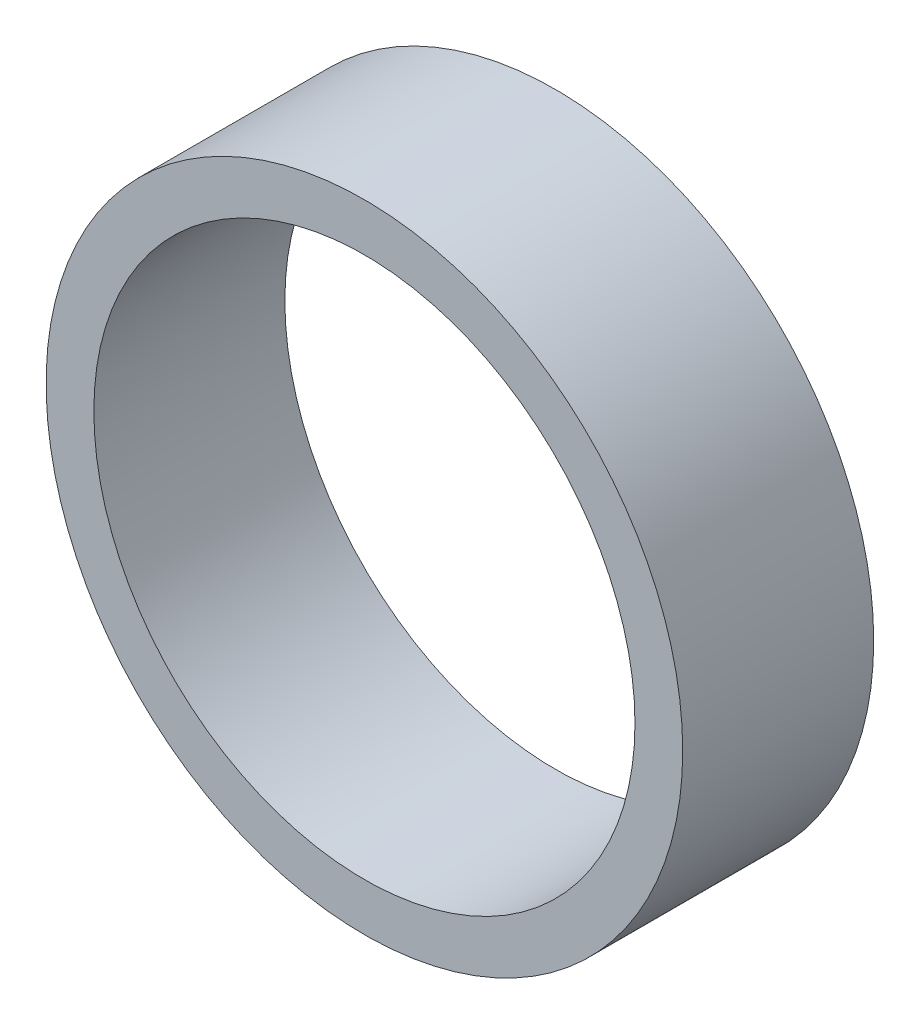
ISO-10303-21;
HEADER;
FILE_DESCRIPTION(('STEP AP214'),'2;1');
FILE_NAME('part.step','',(''),(''),'','','');
FILE_SCHEMA(('AUTOMOTIVE_DESIGN { 1 0 10303 214 1 1 1 1 }'));
ENDSEC;
DATA;
#1=APPLICATION_CONTEXT('core data for automotive mechanical design processes');
#2=APPLICATION_PROTOCOL_DEFINITION('international standard','automotive_design',2000,#1);
#3=PRODUCT_CONTEXT('',#1,'mechanical');
#4=PRODUCT('Part','Part','',(#3));
#5=PRODUCT_RELATED_PRODUCT_CATEGORY('part','',(#4));
#6=PRODUCT_DEFINITION_FORMATION('','',#4);
#7=PRODUCT_DEFINITION_CONTEXT('part definition',#1,'design');
#8=PRODUCT_DEFINITION('design','',#6,#7);
#9=PRODUCT_DEFINITION_SHAPE('','',#8);
#10=(LENGTH_UNIT() NAMED_UNIT(*) SI_UNIT(.MILLI.,.METRE.));
#11=(NAMED_UNIT(*) PLANE_ANGLE_UNIT() SI_UNIT($,.RADIAN.));
#12=(NAMED_UNIT(*) SI_UNIT($,.STERADIAN.) SOLID_ANGLE_UNIT());
#13=UNCERTAINTY_MEASURE_WITH_UNIT(LENGTH_MEASURE(1.E-05),#10,'distance_accuracy_value','');
#14=(GEOMETRIC_REPRESENTATION_CONTEXT(3) GLOBAL_UNCERTAINTY_ASSIGNED_CONTEXT((#13)) GLOBAL_UNIT_ASSIGNED_CONTEXT((#10,
#11,#12)) REPRESENTATION_CONTEXT('',''));
#15=CARTESIAN_POINT('',(0.,0.,0.));
#16=DIRECTION('',(0.,0.,1.));
#17=DIRECTION('',(1.,0.,0.));
#18=AXIS2_PLACEMENT_3D('',#15,#16,#17);
#19=CARTESIAN_POINT('',(0.,0.,6.));
#20=DIRECTION('',(0.,0.,1.));
#21=DIRECTION('',(1.,0.,0.));
#22=AXIS2_PLACEMENT_3D('',#19,#20,#21);
#23=PLANE('',#22);
#24=CARTESIAN_POINT('',(0.,0.,6.));
#25=DIRECTION('',(0.,0.,1.));
#26=DIRECTION('',(1.,0.,0.));
#27=AXIS2_PLACEMENT_3D('',#24,#25,#26);
#28=CIRCLE('',#27,10.);
#29=CARTESIAN_POINT('',(10.,0.,6.));
#30=VERTEX_POINT('',#29);
#31=EDGE_CURVE('E10',#30,#30,#28,.T.);
#32=ORIENTED_EDGE('',*,*,#31,.T.);
#33=EDGE_LOOP('',(#32));
#34=FACE_BOUND('',#33,.T.);
#35=CARTESIAN_POINT('',(0.,0.,6.));
#36=DIRECTION('',(0.,0.,1.));
#37=DIRECTION('',(1.,0.,0.));
#38=AXIS2_PLACEMENT_3D('',#35,#36,#37);
#39=CIRCLE('',#38,8.5);
#40=CARTESIAN_POINT('',(8.5,0.,6.));
#41=VERTEX_POINT('',#40);
#42=EDGE_CURVE('E46',#41,#41,#39,.T.);
#43=ORIENTED_EDGE('',*,*,#42,.F.);
#44=EDGE_LOOP('',(#43));
#45=FACE_BOUND('',#44,.T.);
#46=ADVANCED_FACE('F35',(#34,#45),#23,.T.);
#47=CARTESIAN_POINT('',(0.,0.,0.));
#48=DIRECTION('',(0.,0.,1.));
#49=DIRECTION('',(1.,0.,0.));
#50=AXIS2_PLACEMENT_3D('',#47,#48,#49);
#51=PLANE('',#50);
#52=CARTESIAN_POINT('',(0.,0.,0.));
#53=DIRECTION('',(0.,0.,1.));
#54=DIRECTION('',(1.,0.,0.));
#55=AXIS2_PLACEMENT_3D('',#52,#53,#54);
#56=CIRCLE('',#55,10.);
#57=CARTESIAN_POINT('',(10.,0.,0.));
#58=VERTEX_POINT('',#57);
#59=EDGE_CURVE('E39',#58,#58,#56,.T.);
#60=ORIENTED_EDGE('',*,*,#59,.F.);
#61=EDGE_LOOP('',(#60));
#62=FACE_BOUND('',#61,.T.);
#63=CARTESIAN_POINT('',(0.,0.,0.));
#64=DIRECTION('',(0.,0.,1.));
#65=DIRECTION('',(1.,0.,0.));
#66=AXIS2_PLACEMENT_3D('',#63,#64,#65);
#67=CIRCLE('',#66,8.5);
#68=CARTESIAN_POINT('',(8.5,0.,0.));
#69=VERTEX_POINT('',#68);
#70=EDGE_CURVE('E48',#69,#69,#67,.T.);
#71=ORIENTED_EDGE('',*,*,#70,.T.);
#72=EDGE_LOOP('',(#71));
#73=FACE_BOUND('',#72,.T.);
#74=ADVANCED_FACE('F58',(#62,#73),#51,.F.);
#75=CARTESIAN_POINT('',(0.,0.,6.));
#76=DIRECTION('',(0.,0.,-1.));
#77=DIRECTION('',(-1.,0.,0.));
#78=AXIS2_PLACEMENT_3D('',#75,#76,#77);
#79=CYLINDRICAL_SURFACE('',#78,10.);
#80=ORIENTED_EDGE('',*,*,#31,.F.);
#81=EDGE_LOOP('',(#80));
#82=FACE_BOUND('',#81,.T.);
#83=ORIENTED_EDGE('',*,*,#59,.T.);
#84=EDGE_LOOP('',(#83));
#85=FACE_BOUND('',#84,.T.);
#86=ADVANCED_FACE('F37',(#82,#85),#79,.T.);
#87=CARTESIAN_POINT('',(0.,0.,6.));
#88=DIRECTION('',(0.,0.,-1.));
#89=DIRECTION('',(-1.,0.,0.));
#90=AXIS2_PLACEMENT_3D('',#87,#88,#89);
#91=CYLINDRICAL_SURFACE('',#90,8.5);
#92=ORIENTED_EDGE('',*,*,#42,.T.);
#93=EDGE_LOOP('',(#92));
#94=FACE_BOUND('',#93,.T.);
#95=ORIENTED_EDGE('',*,*,#70,.F.);
#96=EDGE_LOOP('',(#95));
#97=FACE_BOUND('',#96,.T.);
#98=ADVANCED_FACE('F54',(#94,#97),#91,.F.);
#99=CLOSED_SHELL('',(#46,#74,#86,#98));
#100=MANIFOLD_SOLID_BREP('B2',#99);
#101=ADVANCED_BREP_SHAPE_REPRESENTATION('',(#18,#100),#14);
#102=SHAPE_DEFINITION_REPRESENTATION(#9,#101);
ENDSEC;
END-ISO-10303-21;
